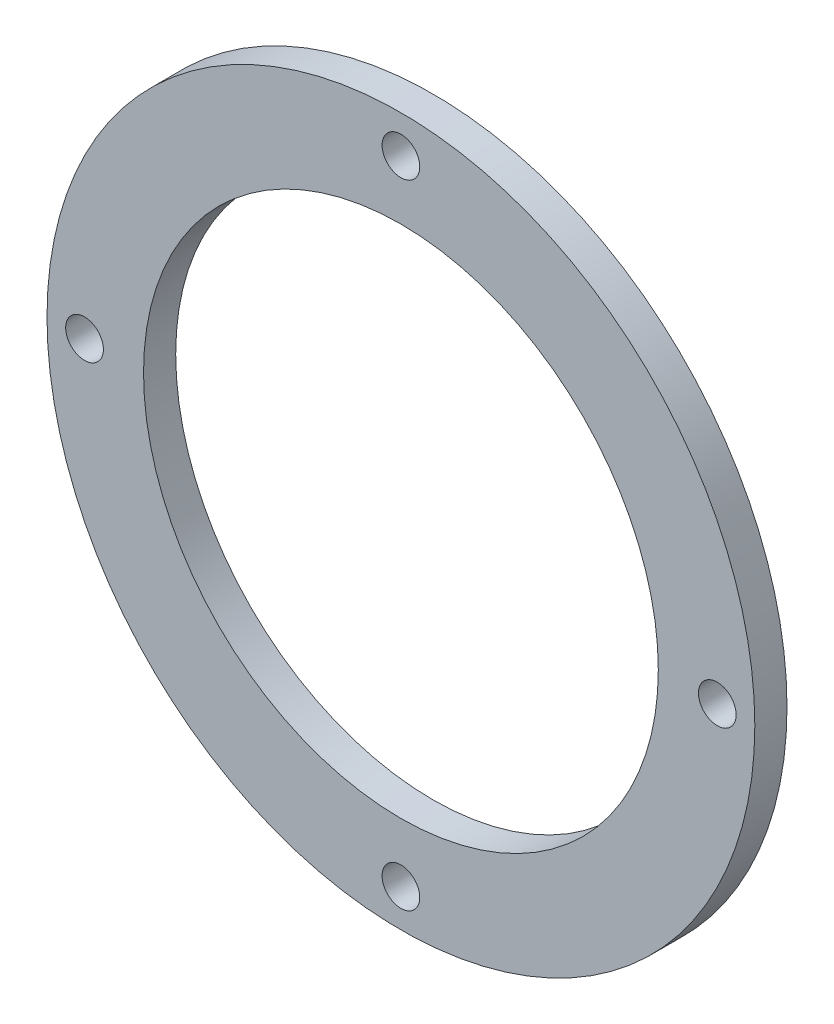
ISO-10303-21;
HEADER;
FILE_DESCRIPTION(('STEP AP214'),'2;1');
FILE_NAME('part.step','',(''),(''),'','','');
FILE_SCHEMA(('AUTOMOTIVE_DESIGN { 1 0 10303 214 1 1 1 1 }'));
ENDSEC;
DATA;
#1=APPLICATION_CONTEXT('core data for automotive mechanical design processes');
#2=APPLICATION_PROTOCOL_DEFINITION('international standard','automotive_design',2000,#1);
#3=PRODUCT_CONTEXT('',#1,'mechanical');
#4=PRODUCT('Part','Part','',(#3));
#5=PRODUCT_RELATED_PRODUCT_CATEGORY('part','',(#4));
#6=PRODUCT_DEFINITION_FORMATION('','',#4);
#7=PRODUCT_DEFINITION_CONTEXT('part definition',#1,'design');
#8=PRODUCT_DEFINITION('design','',#6,#7);
#9=PRODUCT_DEFINITION_SHAPE('','',#8);
#10=(LENGTH_UNIT() NAMED_UNIT(*) SI_UNIT(.MILLI.,.METRE.));
#11=(NAMED_UNIT(*) PLANE_ANGLE_UNIT() SI_UNIT($,.RADIAN.));
#12=(NAMED_UNIT(*) SI_UNIT($,.STERADIAN.) SOLID_ANGLE_UNIT());
#13=UNCERTAINTY_MEASURE_WITH_UNIT(LENGTH_MEASURE(1.E-05),#10,'distance_accuracy_value','');
#14=(GEOMETRIC_REPRESENTATION_CONTEXT(3) GLOBAL_UNCERTAINTY_ASSIGNED_CONTEXT((#13)) GLOBAL_UNIT_ASSIGNED_CONTEXT((#10,
#11,#12)) REPRESENTATION_CONTEXT('',''));
#15=CARTESIAN_POINT('',(0.,0.,0.));
#16=DIRECTION('',(0.,0.,1.));
#17=DIRECTION('',(1.,0.,0.));
#18=AXIS2_PLACEMENT_3D('',#15,#16,#17);
#19=CARTESIAN_POINT('',(0.,0.,3.));
#20=DIRECTION('',(0.,0.,1.));
#21=DIRECTION('',(1.,0.,0.));
#22=AXIS2_PLACEMENT_3D('',#19,#20,#21);
#23=PLANE('',#22);
#24=CARTESIAN_POINT('',(-2.05997398991745E-13,-29.5,3.));
#25=DIRECTION('',(0.,0.,1.));
#26=DIRECTION('',(1.,0.,0.));
#27=AXIS2_PLACEMENT_3D('',#24,#25,#26);
#28=CIRCLE('',#27,1.75723519415784);
#29=CARTESIAN_POINT('',(1.75723519415763,-29.5,3.));
#30=VERTEX_POINT('',#29);
#31=EDGE_CURVE('E78',#30,#30,#28,.T.);
#32=ORIENTED_EDGE('',*,*,#31,.F.);
#33=EDGE_LOOP('',(#32));
#34=FACE_BOUND('',#33,.T.);
#35=CARTESIAN_POINT('',(0.,29.5,3.));
#36=DIRECTION('',(0.,0.,1.));
#37=DIRECTION('',(1.,0.,0.));
#38=AXIS2_PLACEMENT_3D('',#35,#36,#37);
#39=CIRCLE('',#38,1.75723519415783);
#40=CARTESIAN_POINT('',(1.75723519415783,29.5,3.));
#41=VERTEX_POINT('',#40);
#42=EDGE_CURVE('E62',#41,#41,#39,.T.);
#43=ORIENTED_EDGE('',*,*,#42,.F.);
#44=EDGE_LOOP('',(#43));
#45=FACE_BOUND('',#44,.T.);
#46=CARTESIAN_POINT('',(0.,0.,3.));
#47=DIRECTION('',(0.,0.,1.));
#48=DIRECTION('',(1.,0.,0.));
#49=AXIS2_PLACEMENT_3D('',#46,#47,#48);
#50=CIRCLE('',#49,33.);
#51=CARTESIAN_POINT('',(33.,0.,3.));
#52=VERTEX_POINT('',#51);
#53=EDGE_CURVE('E10',#52,#52,#50,.T.);
#54=ORIENTED_EDGE('',*,*,#53,.T.);
#55=EDGE_LOOP('',(#54));
#56=FACE_BOUND('',#55,.T.);
#57=CARTESIAN_POINT('',(0.,0.,3.));
#58=DIRECTION('',(0.,0.,1.));
#59=DIRECTION('',(1.,0.,0.));
#60=AXIS2_PLACEMENT_3D('',#57,#58,#59);
#61=CIRCLE('',#60,24.);
#62=CARTESIAN_POINT('',(24.,0.,3.));
#63=VERTEX_POINT('',#62);
#64=EDGE_CURVE('E56',#63,#63,#61,.T.);
#65=ORIENTED_EDGE('',*,*,#64,.F.);
#66=EDGE_LOOP('',(#65));
#67=FACE_BOUND('',#66,.T.);
#68=CARTESIAN_POINT('',(29.5,-1.02998699495872E-13,3.));
#69=DIRECTION('',(0.,0.,1.));
#70=DIRECTION('',(1.,0.,0.));
#71=AXIS2_PLACEMENT_3D('',#68,#69,#70);
#72=CIRCLE('',#71,1.75723519415783);
#73=CARTESIAN_POINT('',(31.2572351941578,-1.02998699495872E-13,3.));
#74=VERTEX_POINT('',#73);
#75=EDGE_CURVE('E70',#74,#74,#72,.T.);
#76=ORIENTED_EDGE('',*,*,#75,.F.);
#77=EDGE_LOOP('',(#76));
#78=FACE_BOUND('',#77,.T.);
#79=CARTESIAN_POINT('',(-29.5,3.08996098487617E-13,3.));
#80=DIRECTION('',(0.,0.,1.));
#81=DIRECTION('',(1.,0.,0.));
#82=AXIS2_PLACEMENT_3D('',#79,#80,#81);
#83=CIRCLE('',#82,1.75723519415783);
#84=CARTESIAN_POINT('',(-27.7427648058422,3.08996098487617E-13,3.));
#85=VERTEX_POINT('',#84);
#86=EDGE_CURVE('E86',#85,#85,#83,.T.);
#87=ORIENTED_EDGE('',*,*,#86,.F.);
#88=EDGE_LOOP('',(#87));
#89=FACE_BOUND('',#88,.T.);
#90=ADVANCED_FACE('F43',(#34,#45,#56,#67,#78,#89),#23,.T.);
#91=CARTESIAN_POINT('',(0.,0.,0.));
#92=DIRECTION('',(0.,0.,1.));
#93=DIRECTION('',(1.,0.,0.));
#94=AXIS2_PLACEMENT_3D('',#91,#92,#93);
#95=PLANE('',#94);
#96=CARTESIAN_POINT('',(0.,0.,0.));
#97=DIRECTION('',(0.,0.,1.));
#98=DIRECTION('',(1.,0.,0.));
#99=AXIS2_PLACEMENT_3D('',#96,#97,#98);
#100=CIRCLE('',#99,33.);
#101=CARTESIAN_POINT('',(33.,0.,0.));
#102=VERTEX_POINT('',#101);
#103=EDGE_CURVE('E47',#102,#102,#100,.T.);
#104=ORIENTED_EDGE('',*,*,#103,.F.);
#105=EDGE_LOOP('',(#104));
#106=FACE_BOUND('',#105,.T.);
#107=CARTESIAN_POINT('',(0.,0.,0.));
#108=DIRECTION('',(0.,0.,1.));
#109=DIRECTION('',(1.,0.,0.));
#110=AXIS2_PLACEMENT_3D('',#107,#108,#109);
#111=CIRCLE('',#110,24.);
#112=CARTESIAN_POINT('',(24.,0.,0.));
#113=VERTEX_POINT('',#112);
#114=EDGE_CURVE('E58',#113,#113,#111,.T.);
#115=ORIENTED_EDGE('',*,*,#114,.T.);
#116=EDGE_LOOP('',(#115));
#117=FACE_BOUND('',#116,.T.);
#118=CARTESIAN_POINT('',(0.,29.5,0.));
#119=DIRECTION('',(0.,0.,1.));
#120=DIRECTION('',(1.,0.,0.));
#121=AXIS2_PLACEMENT_3D('',#118,#119,#120);
#122=CIRCLE('',#121,1.75723519415783);
#123=CARTESIAN_POINT('',(1.75723519415783,29.5,0.));
#124=VERTEX_POINT('',#123);
#125=EDGE_CURVE('E66',#124,#124,#122,.T.);
#126=ORIENTED_EDGE('',*,*,#125,.T.);
#127=EDGE_LOOP('',(#126));
#128=FACE_BOUND('',#127,.T.);
#129=CARTESIAN_POINT('',(29.5,-1.02998699495872E-13,0.));
#130=DIRECTION('',(0.,0.,1.));
#131=DIRECTION('',(1.,0.,0.));
#132=AXIS2_PLACEMENT_3D('',#129,#130,#131);
#133=CIRCLE('',#132,1.75723519415783);
#134=CARTESIAN_POINT('',(31.2572351941578,-1.02998699495872E-13,0.));
#135=VERTEX_POINT('',#134);
#136=EDGE_CURVE('E74',#135,#135,#133,.T.);
#137=ORIENTED_EDGE('',*,*,#136,.T.);
#138=EDGE_LOOP('',(#137));
#139=FACE_BOUND('',#138,.T.);
#140=CARTESIAN_POINT('',(-2.05997398991745E-13,-29.5,0.));
#141=DIRECTION('',(0.,0.,1.));
#142=DIRECTION('',(1.,0.,0.));
#143=AXIS2_PLACEMENT_3D('',#140,#141,#142);
#144=CIRCLE('',#143,1.75723519415784);
#145=CARTESIAN_POINT('',(1.75723519415763,-29.5,0.));
#146=VERTEX_POINT('',#145);
#147=EDGE_CURVE('E82',#146,#146,#144,.T.);
#148=ORIENTED_EDGE('',*,*,#147,.T.);
#149=EDGE_LOOP('',(#148));
#150=FACE_BOUND('',#149,.T.);
#151=CARTESIAN_POINT('',(-29.5,3.08996098487617E-13,0.));
#152=DIRECTION('',(0.,0.,1.));
#153=DIRECTION('',(1.,0.,0.));
#154=AXIS2_PLACEMENT_3D('',#151,#152,#153);
#155=CIRCLE('',#154,1.75723519415783);
#156=CARTESIAN_POINT('',(-27.7427648058422,3.08996098487617E-13,0.));
#157=VERTEX_POINT('',#156);
#158=EDGE_CURVE('E90',#157,#157,#155,.T.);
#159=ORIENTED_EDGE('',*,*,#158,.T.);
#160=EDGE_LOOP('',(#159));
#161=FACE_BOUND('',#160,.T.);
#162=ADVANCED_FACE('F102',(#106,#117,#128,#139,#150,#161),#95,.F.);
#163=CARTESIAN_POINT('',(0.,0.,3.));
#164=DIRECTION('',(0.,0.,-1.));
#165=DIRECTION('',(-1.,0.,0.));
#166=AXIS2_PLACEMENT_3D('',#163,#164,#165);
#167=CYLINDRICAL_SURFACE('',#166,33.);
#168=ORIENTED_EDGE('',*,*,#53,.F.);
#169=EDGE_LOOP('',(#168));
#170=FACE_BOUND('',#169,.T.);
#171=ORIENTED_EDGE('',*,*,#103,.T.);
#172=EDGE_LOOP('',(#171));
#173=FACE_BOUND('',#172,.T.);
#174=ADVANCED_FACE('F45',(#170,#173),#167,.T.);
#175=CARTESIAN_POINT('',(0.,0.,3.));
#176=DIRECTION('',(0.,0.,-1.));
#177=DIRECTION('',(-1.,0.,0.));
#178=AXIS2_PLACEMENT_3D('',#175,#176,#177);
#179=CYLINDRICAL_SURFACE('',#178,24.);
#180=ORIENTED_EDGE('',*,*,#64,.T.);
#181=EDGE_LOOP('',(#180));
#182=FACE_BOUND('',#181,.T.);
#183=ORIENTED_EDGE('',*,*,#114,.F.);
#184=EDGE_LOOP('',(#183));
#185=FACE_BOUND('',#184,.T.);
#186=ADVANCED_FACE('F112',(#182,#185),#179,.F.);
#187=CARTESIAN_POINT('',(0.,29.5,3.));
#188=DIRECTION('',(0.,0.,-1.));
#189=DIRECTION('',(-1.,0.,0.));
#190=AXIS2_PLACEMENT_3D('',#187,#188,#189);
#191=CYLINDRICAL_SURFACE('',#190,1.75723519415783);
#192=ORIENTED_EDGE('',*,*,#42,.T.);
#193=EDGE_LOOP('',(#192));
#194=FACE_BOUND('',#193,.T.);
#195=ORIENTED_EDGE('',*,*,#125,.F.);
#196=EDGE_LOOP('',(#195));
#197=FACE_BOUND('',#196,.T.);
#198=ADVANCED_FACE('F115',(#194,#197),#191,.F.);
#199=CARTESIAN_POINT('',(29.5,-1.02998699495872E-13,3.));
#200=DIRECTION('',(0.,0.,-1.));
#201=DIRECTION('',(-1.,0.,0.));
#202=AXIS2_PLACEMENT_3D('',#199,#200,#201);
#203=CYLINDRICAL_SURFACE('',#202,1.75723519415783);
#204=ORIENTED_EDGE('',*,*,#75,.T.);
#205=EDGE_LOOP('',(#204));
#206=FACE_BOUND('',#205,.T.);
#207=ORIENTED_EDGE('',*,*,#136,.F.);
#208=EDGE_LOOP('',(#207));
#209=FACE_BOUND('',#208,.T.);
#210=ADVANCED_FACE('F119',(#206,#209),#203,.F.);
#211=CARTESIAN_POINT('',(-2.05997398991745E-13,-29.5,3.));
#212=DIRECTION('',(0.,0.,-1.));
#213=DIRECTION('',(-1.,0.,0.));
#214=AXIS2_PLACEMENT_3D('',#211,#212,#213);
#215=CYLINDRICAL_SURFACE('',#214,1.75723519415784);
#216=ORIENTED_EDGE('',*,*,#31,.T.);
#217=EDGE_LOOP('',(#216));
#218=FACE_BOUND('',#217,.T.);
#219=ORIENTED_EDGE('',*,*,#147,.F.);
#220=EDGE_LOOP('',(#219));
#221=FACE_BOUND('',#220,.T.);
#222=ADVANCED_FACE('F123',(#218,#221),#215,.F.);
#223=CARTESIAN_POINT('',(-29.5,3.08996098487617E-13,3.));
#224=DIRECTION('',(0.,0.,-1.));
#225=DIRECTION('',(-1.,0.,0.));
#226=AXIS2_PLACEMENT_3D('',#223,#224,#225);
#227=CYLINDRICAL_SURFACE('',#226,1.75723519415783);
#228=ORIENTED_EDGE('',*,*,#86,.T.);
#229=EDGE_LOOP('',(#228));
#230=FACE_BOUND('',#229,.T.);
#231=ORIENTED_EDGE('',*,*,#158,.F.);
#232=EDGE_LOOP('',(#231));
#233=FACE_BOUND('',#232,.T.);
#234=ADVANCED_FACE('F98',(#230,#233),#227,.F.);
#235=CLOSED_SHELL('',(#90,#162,#174,#186,#198,#210,#222,#234));
#236=MANIFOLD_SOLID_BREP('B2',#235);
#237=ADVANCED_BREP_SHAPE_REPRESENTATION('',(#18,#236),#14);
#238=SHAPE_DEFINITION_REPRESENTATION(#9,#237);
ENDSEC;
END-ISO-10303-21;
